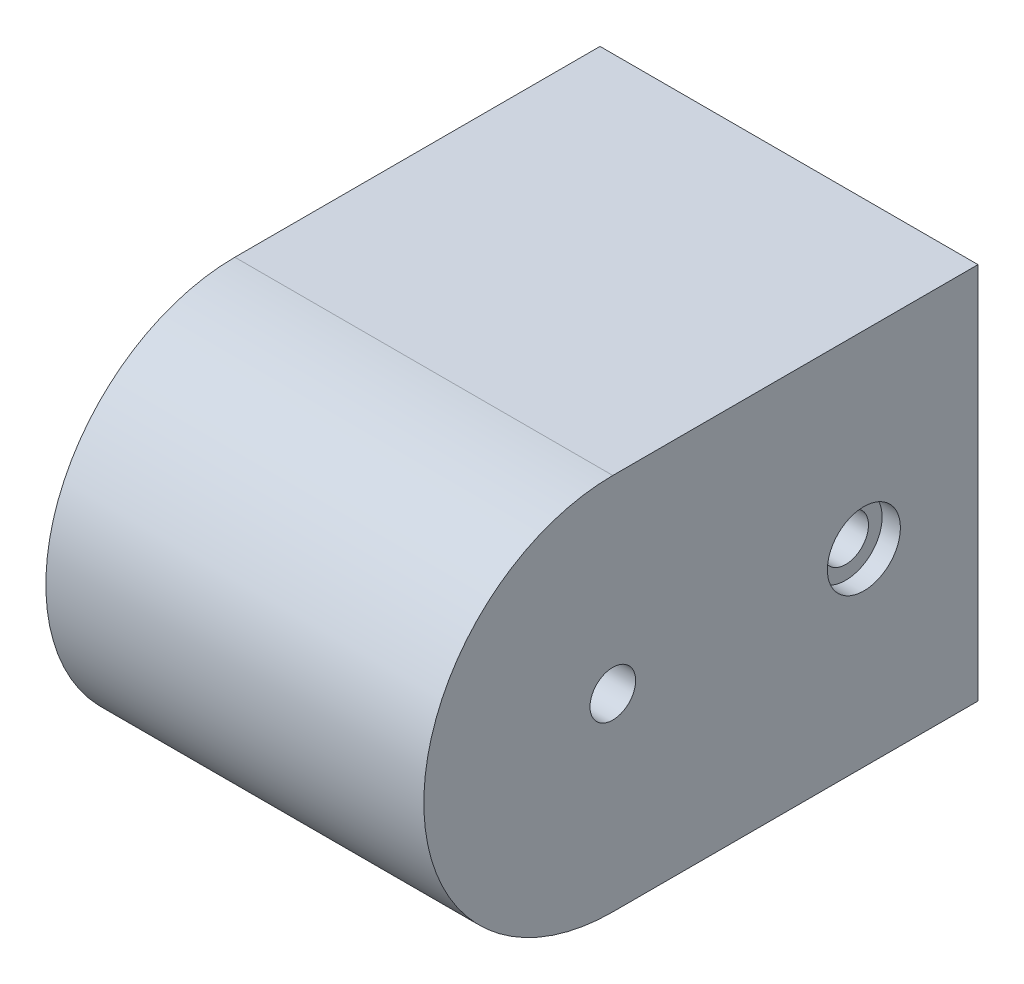
ISO-10303-21;
HEADER;
FILE_DESCRIPTION(('STEP AP214'),'2;1');
FILE_NAME('part.step','',(''),(''),'','','');
FILE_SCHEMA(('AUTOMOTIVE_DESIGN { 1 0 10303 214 1 1 1 1 }'));
ENDSEC;
DATA;
#1=APPLICATION_CONTEXT('core data for automotive mechanical design processes');
#2=APPLICATION_PROTOCOL_DEFINITION('international standard','automotive_design',2000,#1);
#3=PRODUCT_CONTEXT('',#1,'mechanical');
#4=PRODUCT('Part','Part','',(#3));
#5=PRODUCT_RELATED_PRODUCT_CATEGORY('part','',(#4));
#6=PRODUCT_DEFINITION_FORMATION('','',#4);
#7=PRODUCT_DEFINITION_CONTEXT('part definition',#1,'design');
#8=PRODUCT_DEFINITION('design','',#6,#7);
#9=PRODUCT_DEFINITION_SHAPE('','',#8);
#10=(LENGTH_UNIT() NAMED_UNIT(*) SI_UNIT(.MILLI.,.METRE.));
#11=(NAMED_UNIT(*) PLANE_ANGLE_UNIT() SI_UNIT($,.RADIAN.));
#12=(NAMED_UNIT(*) SI_UNIT($,.STERADIAN.) SOLID_ANGLE_UNIT());
#13=UNCERTAINTY_MEASURE_WITH_UNIT(LENGTH_MEASURE(1.E-05),#10,'distance_accuracy_value','');
#14=(GEOMETRIC_REPRESENTATION_CONTEXT(3) GLOBAL_UNCERTAINTY_ASSIGNED_CONTEXT((#13)) GLOBAL_UNIT_ASSIGNED_CONTEXT((#10,
#11,#12)) REPRESENTATION_CONTEXT('',''));
#15=CARTESIAN_POINT('',(0.,0.,0.));
#16=DIRECTION('',(0.,0.,1.));
#17=DIRECTION('',(1.,0.,0.));
#18=AXIS2_PLACEMENT_3D('',#15,#16,#17);
#19=CARTESIAN_POINT('',(27.7710678118655,0.,12.5));
#20=DIRECTION('',(-1.,0.,0.));
#21=DIRECTION('',(0.,0.,1.));
#22=AXIS2_PLACEMENT_3D('',#19,#20,#21);
#23=CYLINDRICAL_SURFACE('',#22,2.5);
#24=CARTESIAN_POINT('',(12.7,0.,12.5));
#25=DIRECTION('',(-1.,0.,0.));
#26=DIRECTION('',(0.,-1.,0.));
#27=AXIS2_PLACEMENT_3D('',#24,#25,#26);
#28=CIRCLE('',#27,2.5);
#29=CARTESIAN_POINT('',(12.7,-2.5,12.5));
#30=VERTEX_POINT('',#29);
#31=EDGE_CURVE('E173',#30,#30,#28,.T.);
#32=ORIENTED_EDGE('',*,*,#31,.T.);
#33=EDGE_LOOP('',(#32));
#34=FACE_BOUND('',#33,.T.);
#35=CARTESIAN_POINT('',(18.7,0.,12.5));
#36=DIRECTION('',(1.,0.,0.));
#37=DIRECTION('',(0.,0.,-1.));
#38=AXIS2_PLACEMENT_3D('',#35,#36,#37);
#39=CIRCLE('',#38,2.5);
#40=CARTESIAN_POINT('',(18.7,0.,10.));
#41=VERTEX_POINT('',#40);
#42=EDGE_CURVE('E36',#41,#41,#39,.F.);
#43=ORIENTED_EDGE('',*,*,#42,.F.);
#44=EDGE_LOOP('',(#43));
#45=FACE_BOUND('',#44,.T.);
#46=ADVANCED_FACE('F32',(#34,#45),#23,.F.);
#47=CARTESIAN_POINT('',(-12.7,0.,12.5));
#48=DIRECTION('',(1.,0.,0.));
#49=DIRECTION('',(0.,1.,0.));
#50=AXIS2_PLACEMENT_3D('',#47,#48,#49);
#51=CIRCLE('',#50,2.5);
#52=CARTESIAN_POINT('',(-12.7,2.5,12.5));
#53=VERTEX_POINT('',#52);
#54=EDGE_CURVE('E171',#53,#53,#51,.T.);
#55=ORIENTED_EDGE('',*,*,#54,.T.);
#56=EDGE_LOOP('',(#55));
#57=FACE_BOUND('',#56,.T.);
#58=CARTESIAN_POINT('',(-18.7,0.,12.5));
#59=DIRECTION('',(-1.,0.,0.));
#60=DIRECTION('',(0.,0.,1.));
#61=AXIS2_PLACEMENT_3D('',#58,#59,#60);
#62=CIRCLE('',#61,2.5);
#63=CARTESIAN_POINT('',(-18.7,0.,15.));
#64=VERTEX_POINT('',#63);
#65=EDGE_CURVE('E174',#64,#64,#62,.F.);
#66=ORIENTED_EDGE('',*,*,#65,.F.);
#67=EDGE_LOOP('',(#66));
#68=FACE_BOUND('',#67,.T.);
#69=ADVANCED_FACE('F213',(#57,#68),#23,.F.);
#70=CARTESIAN_POINT('',(0.,0.,0.));
#71=DIRECTION('',(0.,0.,1.));
#72=DIRECTION('',(1.,0.,0.));
#73=AXIS2_PLACEMENT_3D('',#70,#71,#72);
#74=PLANE('',#73);
#75=DIRECTION('',(0.,1.,0.));
#76=VECTOR('',#75,1.);
#77=CARTESIAN_POINT('',(20.7,20.7,0.));
#78=LINE('',#77,#76);
#79=CARTESIAN_POINT('',(20.7,-20.7,0.));
#80=VERTEX_POINT('',#79);
#81=CARTESIAN_POINT('',(20.7,20.7,0.));
#82=VERTEX_POINT('',#81);
#83=EDGE_CURVE('E161',#80,#82,#78,.T.);
#84=ORIENTED_EDGE('',*,*,#83,.F.);
#85=DIRECTION('',(1.,0.,0.));
#86=VECTOR('',#85,1.);
#87=CARTESIAN_POINT('',(-20.7,-20.7,0.));
#88=LINE('',#87,#86);
#89=CARTESIAN_POINT('',(-20.7,-20.7,0.));
#90=VERTEX_POINT('',#89);
#91=EDGE_CURVE('E167',#90,#80,#88,.T.);
#92=ORIENTED_EDGE('',*,*,#91,.F.);
#93=DIRECTION('',(0.,-1.,0.));
#94=VECTOR('',#93,1.);
#95=CARTESIAN_POINT('',(-20.7,20.7,0.));
#96=LINE('',#95,#94);
#97=CARTESIAN_POINT('',(-20.7,20.7,0.));
#98=VERTEX_POINT('',#97);
#99=EDGE_CURVE('E121',#98,#90,#96,.T.);
#100=ORIENTED_EDGE('',*,*,#99,.F.);
#101=DIRECTION('',(-1.,0.,0.));
#102=VECTOR('',#101,1.);
#103=CARTESIAN_POINT('',(-20.7,20.7,0.));
#104=LINE('',#103,#102);
#105=EDGE_CURVE('E164',#82,#98,#104,.T.);
#106=ORIENTED_EDGE('',*,*,#105,.F.);
#107=EDGE_LOOP('',(#84,#92,#100,#106));
#108=FACE_BOUND('',#107,.T.);
#109=DIRECTION('',(0.,1.,0.));
#110=VECTOR('',#109,1.);
#111=CARTESIAN_POINT('',(12.7,12.7,0.));
#112=LINE('',#111,#110);
#113=CARTESIAN_POINT('',(12.7,-12.7,0.));
#114=VERTEX_POINT('',#113);
#115=CARTESIAN_POINT('',(12.7,12.7,0.));
#116=VERTEX_POINT('',#115);
#117=EDGE_CURVE('E57',#114,#116,#112,.T.);
#118=ORIENTED_EDGE('',*,*,#117,.T.);
#119=DIRECTION('',(-1.,0.,0.));
#120=VECTOR('',#119,1.);
#121=CARTESIAN_POINT('',(-12.7,12.7,0.));
#122=LINE('',#121,#120);
#123=CARTESIAN_POINT('',(-12.7,12.7,0.));
#124=VERTEX_POINT('',#123);
#125=EDGE_CURVE('E146',#116,#124,#122,.T.);
#126=ORIENTED_EDGE('',*,*,#125,.T.);
#127=DIRECTION('',(0.,-1.,0.));
#128=VECTOR('',#127,1.);
#129=CARTESIAN_POINT('',(-12.7,12.7,0.));
#130=LINE('',#129,#128);
#131=CARTESIAN_POINT('',(-12.7,-12.7,0.));
#132=VERTEX_POINT('',#131);
#133=EDGE_CURVE('E149',#124,#132,#130,.T.);
#134=ORIENTED_EDGE('',*,*,#133,.T.);
#135=DIRECTION('',(1.,0.,0.));
#136=VECTOR('',#135,1.);
#137=CARTESIAN_POINT('',(-12.7,-12.7,0.));
#138=LINE('',#137,#136);
#139=EDGE_CURVE('E137',#132,#114,#138,.T.);
#140=ORIENTED_EDGE('',*,*,#139,.T.);
#141=EDGE_LOOP('',(#118,#126,#134,#140));
#142=FACE_BOUND('',#141,.T.);
#143=ADVANCED_FACE('F219',(#108,#142),#74,.F.);
#144=CARTESIAN_POINT('',(20.7,20.7,30.));
#145=DIRECTION('',(-1.,0.,0.));
#146=DIRECTION('',(0.,0.,1.));
#147=AXIS2_PLACEMENT_3D('',#144,#145,#146);
#148=PLANE('',#147);
#149=CARTESIAN_POINT('',(20.7,0.,12.5));
#150=DIRECTION('',(1.,0.,0.));
#151=DIRECTION('',(0.,0.,-1.));
#152=AXIS2_PLACEMENT_3D('',#149,#150,#151);
#153=CIRCLE('',#152,4.);
#154=CARTESIAN_POINT('',(20.7,0.,8.5));
#155=VERTEX_POINT('',#154);
#156=EDGE_CURVE('E187',#155,#155,#153,.T.);
#157=ORIENTED_EDGE('',*,*,#156,.F.);
#158=EDGE_LOOP('',(#157));
#159=FACE_BOUND('',#158,.T.);
#160=CARTESIAN_POINT('',(20.7,0.,40.));
#161=DIRECTION('',(1.,0.,0.));
#162=DIRECTION('',(0.,0.,-1.));
#163=AXIS2_PLACEMENT_3D('',#160,#161,#162);
#164=CIRCLE('',#163,2.5);
#165=CARTESIAN_POINT('',(20.7,0.,37.5));
#166=VERTEX_POINT('',#165);
#167=EDGE_CURVE('E191',#166,#166,#164,.T.);
#168=ORIENTED_EDGE('',*,*,#167,.F.);
#169=EDGE_LOOP('',(#168));
#170=FACE_BOUND('',#169,.T.);
#171=ORIENTED_EDGE('',*,*,#83,.T.);
#172=DIRECTION('',(0.,0.,-1.));
#173=VECTOR('',#172,1.);
#174=CARTESIAN_POINT('',(20.7,20.7,30.));
#175=LINE('',#174,#173);
#176=CARTESIAN_POINT('',(20.7,20.7,40.));
#177=VERTEX_POINT('',#176);
#178=EDGE_CURVE('E11',#177,#82,#175,.T.);
#179=ORIENTED_EDGE('',*,*,#178,.F.);
#180=CARTESIAN_POINT('',(20.7,0.,40.));
#181=DIRECTION('',(1.,0.,0.));
#182=DIRECTION('',(0.,0.,1.));
#183=AXIS2_PLACEMENT_3D('',#180,#181,#182);
#184=CIRCLE('',#183,20.7);
#185=CARTESIAN_POINT('',(20.7,-20.7,40.));
#186=VERTEX_POINT('',#185);
#187=EDGE_CURVE('E125',#177,#186,#184,.T.);
#188=ORIENTED_EDGE('',*,*,#187,.T.);
#189=DIRECTION('',(0.,0.,-1.));
#190=VECTOR('',#189,1.);
#191=CARTESIAN_POINT('',(20.7,-20.7,30.));
#192=LINE('',#191,#190);
#193=EDGE_CURVE('E107',#186,#80,#192,.T.);
#194=ORIENTED_EDGE('',*,*,#193,.T.);
#195=EDGE_LOOP('',(#171,#179,#188,#194));
#196=FACE_BOUND('',#195,.T.);
#197=ADVANCED_FACE('F34',(#159,#170,#196),#148,.F.);
#198=CARTESIAN_POINT('',(-20.7,20.7,30.));
#199=DIRECTION('',(0.,-1.,0.));
#200=DIRECTION('',(0.,0.,-1.));
#201=AXIS2_PLACEMENT_3D('',#198,#199,#200);
#202=PLANE('',#201);
#203=ORIENTED_EDGE('',*,*,#105,.T.);
#204=DIRECTION('',(0.,0.,-1.));
#205=VECTOR('',#204,1.);
#206=CARTESIAN_POINT('',(-20.7,20.7,30.));
#207=LINE('',#206,#205);
#208=CARTESIAN_POINT('',(-20.7,20.7,40.));
#209=VERTEX_POINT('',#208);
#210=EDGE_CURVE('E41',#209,#98,#207,.T.);
#211=ORIENTED_EDGE('',*,*,#210,.F.);
#212=DIRECTION('',(-1.,0.,0.));
#213=VECTOR('',#212,1.);
#214=CARTESIAN_POINT('',(-20.7,20.7,40.));
#215=LINE('',#214,#213);
#216=EDGE_CURVE('E112',#177,#209,#215,.T.);
#217=ORIENTED_EDGE('',*,*,#216,.F.);
#218=ORIENTED_EDGE('',*,*,#178,.T.);
#219=EDGE_LOOP('',(#203,#211,#217,#218));
#220=FACE_BOUND('',#219,.T.);
#221=ADVANCED_FACE('F201',(#220),#202,.F.);
#222=CARTESIAN_POINT('',(-20.7,20.7,30.));
#223=DIRECTION('',(1.,0.,0.));
#224=DIRECTION('',(0.,0.,-1.));
#225=AXIS2_PLACEMENT_3D('',#222,#223,#224);
#226=PLANE('',#225);
#227=CARTESIAN_POINT('',(-20.7,0.,12.5));
#228=DIRECTION('',(-1.,0.,0.));
#229=DIRECTION('',(0.,0.,1.));
#230=AXIS2_PLACEMENT_3D('',#227,#228,#229);
#231=CIRCLE('',#230,4.);
#232=CARTESIAN_POINT('',(-20.7,0.,16.5));
#233=VERTEX_POINT('',#232);
#234=EDGE_CURVE('E180',#233,#233,#231,.T.);
#235=ORIENTED_EDGE('',*,*,#234,.F.);
#236=EDGE_LOOP('',(#235));
#237=FACE_BOUND('',#236,.T.);
#238=CARTESIAN_POINT('',(-20.7,0.,40.));
#239=DIRECTION('',(1.,0.,0.));
#240=DIRECTION('',(0.,0.,-1.));
#241=AXIS2_PLACEMENT_3D('',#238,#239,#240);
#242=CIRCLE('',#241,2.5);
#243=CARTESIAN_POINT('',(-20.7,0.,37.5));
#244=VERTEX_POINT('',#243);
#245=EDGE_CURVE('E128',#244,#244,#242,.F.);
#246=ORIENTED_EDGE('',*,*,#245,.F.);
#247=EDGE_LOOP('',(#246));
#248=FACE_BOUND('',#247,.T.);
#249=ORIENTED_EDGE('',*,*,#99,.T.);
#250=DIRECTION('',(0.,0.,-1.));
#251=VECTOR('',#250,1.);
#252=CARTESIAN_POINT('',(-20.7,-20.7,30.));
#253=LINE('',#252,#251);
#254=CARTESIAN_POINT('',(-20.7,-20.7,40.));
#255=VERTEX_POINT('',#254);
#256=EDGE_CURVE('E104',#255,#90,#253,.T.);
#257=ORIENTED_EDGE('',*,*,#256,.F.);
#258=CARTESIAN_POINT('',(-20.7,0.,40.));
#259=DIRECTION('',(1.,0.,0.));
#260=DIRECTION('',(0.,0.,-1.));
#261=AXIS2_PLACEMENT_3D('',#258,#259,#260);
#262=CIRCLE('',#261,20.7);
#263=EDGE_CURVE('E118',#255,#209,#262,.F.);
#264=ORIENTED_EDGE('',*,*,#263,.T.);
#265=ORIENTED_EDGE('',*,*,#210,.T.);
#266=EDGE_LOOP('',(#249,#257,#264,#265));
#267=FACE_BOUND('',#266,.T.);
#268=ADVANCED_FACE('F116',(#237,#248,#267),#226,.F.);
#269=CARTESIAN_POINT('',(-20.7,-20.7,30.));
#270=DIRECTION('',(0.,1.,0.));
#271=DIRECTION('',(0.,0.,1.));
#272=AXIS2_PLACEMENT_3D('',#269,#270,#271);
#273=PLANE('',#272);
#274=ORIENTED_EDGE('',*,*,#91,.T.);
#275=ORIENTED_EDGE('',*,*,#193,.F.);
#276=DIRECTION('',(1.,0.,0.));
#277=VECTOR('',#276,1.);
#278=CARTESIAN_POINT('',(-20.7,-20.7,40.));
#279=LINE('',#278,#277);
#280=EDGE_CURVE('E101',#255,#186,#279,.T.);
#281=ORIENTED_EDGE('',*,*,#280,.F.);
#282=ORIENTED_EDGE('',*,*,#256,.T.);
#283=EDGE_LOOP('',(#274,#275,#281,#282));
#284=FACE_BOUND('',#283,.T.);
#285=ADVANCED_FACE('F103',(#284),#273,.F.);
#286=CARTESIAN_POINT('',(12.7,12.7,30.));
#287=DIRECTION('',(-1.,0.,0.));
#288=DIRECTION('',(0.,-1.,0.));
#289=AXIS2_PLACEMENT_3D('',#286,#287,#288);
#290=PLANE('',#289);
#291=ORIENTED_EDGE('',*,*,#31,.F.);
#292=EDGE_LOOP('',(#291));
#293=FACE_BOUND('',#292,.T.);
#294=ORIENTED_EDGE('',*,*,#117,.F.);
#295=DIRECTION('',(0.,0.,-1.));
#296=VECTOR('',#295,1.);
#297=CARTESIAN_POINT('',(12.7,-12.7,30.));
#298=LINE('',#297,#296);
#299=CARTESIAN_POINT('',(12.7,-12.7,30.));
#300=VERTEX_POINT('',#299);
#301=EDGE_CURVE('E144',#300,#114,#298,.T.);
#302=ORIENTED_EDGE('',*,*,#301,.F.);
#303=DIRECTION('',(0.,1.,0.));
#304=VECTOR('',#303,1.);
#305=CARTESIAN_POINT('',(12.7,12.7,30.));
#306=LINE('',#305,#304);
#307=CARTESIAN_POINT('',(12.7,12.7,30.));
#308=VERTEX_POINT('',#307);
#309=EDGE_CURVE('E133',#300,#308,#306,.T.);
#310=ORIENTED_EDGE('',*,*,#309,.T.);
#311=DIRECTION('',(0.,0.,-1.));
#312=VECTOR('',#311,1.);
#313=CARTESIAN_POINT('',(12.7,12.7,30.));
#314=LINE('',#313,#312);
#315=EDGE_CURVE('E159',#308,#116,#314,.T.);
#316=ORIENTED_EDGE('',*,*,#315,.T.);
#317=EDGE_LOOP('',(#294,#302,#310,#316));
#318=FACE_BOUND('',#317,.T.);
#319=ADVANCED_FACE('F208',(#293,#318),#290,.T.);
#320=CARTESIAN_POINT('',(-12.7,12.7,30.));
#321=DIRECTION('',(0.,-1.,0.));
#322=DIRECTION('',(0.,0.,-1.));
#323=AXIS2_PLACEMENT_3D('',#320,#321,#322);
#324=PLANE('',#323);
#325=ORIENTED_EDGE('',*,*,#125,.F.);
#326=ORIENTED_EDGE('',*,*,#315,.F.);
#327=DIRECTION('',(-1.,0.,0.));
#328=VECTOR('',#327,1.);
#329=CARTESIAN_POINT('',(-12.7,12.7,30.));
#330=LINE('',#329,#328);
#331=CARTESIAN_POINT('',(-12.7,12.7,30.));
#332=VERTEX_POINT('',#331);
#333=EDGE_CURVE('E136',#308,#332,#330,.T.);
#334=ORIENTED_EDGE('',*,*,#333,.T.);
#335=DIRECTION('',(0.,0.,-1.));
#336=VECTOR('',#335,1.);
#337=CARTESIAN_POINT('',(-12.7,12.7,30.));
#338=LINE('',#337,#336);
#339=EDGE_CURVE('E157',#332,#124,#338,.T.);
#340=ORIENTED_EDGE('',*,*,#339,.T.);
#341=EDGE_LOOP('',(#325,#326,#334,#340));
#342=FACE_BOUND('',#341,.T.);
#343=ADVANCED_FACE('F241',(#342),#324,.T.);
#344=CARTESIAN_POINT('',(-12.7,12.7,30.));
#345=DIRECTION('',(1.,0.,0.));
#346=DIRECTION('',(0.,1.,0.));
#347=AXIS2_PLACEMENT_3D('',#344,#345,#346);
#348=PLANE('',#347);
#349=ORIENTED_EDGE('',*,*,#54,.F.);
#350=EDGE_LOOP('',(#349));
#351=FACE_BOUND('',#350,.T.);
#352=ORIENTED_EDGE('',*,*,#133,.F.);
#353=ORIENTED_EDGE('',*,*,#339,.F.);
#354=DIRECTION('',(0.,-1.,0.));
#355=VECTOR('',#354,1.);
#356=CARTESIAN_POINT('',(-12.7,12.7,30.));
#357=LINE('',#356,#355);
#358=CARTESIAN_POINT('',(-12.7,-12.7,30.));
#359=VERTEX_POINT('',#358);
#360=EDGE_CURVE('E140',#332,#359,#357,.T.);
#361=ORIENTED_EDGE('',*,*,#360,.T.);
#362=DIRECTION('',(0.,0.,-1.));
#363=VECTOR('',#362,1.);
#364=CARTESIAN_POINT('',(-12.7,-12.7,30.));
#365=LINE('',#364,#363);
#366=EDGE_CURVE('E155',#359,#132,#365,.T.);
#367=ORIENTED_EDGE('',*,*,#366,.T.);
#368=EDGE_LOOP('',(#352,#353,#361,#367));
#369=FACE_BOUND('',#368,.T.);
#370=ADVANCED_FACE('F237',(#351,#369),#348,.T.);
#371=CARTESIAN_POINT('',(-12.7,-12.7,30.));
#372=DIRECTION('',(0.,1.,0.));
#373=DIRECTION('',(0.,0.,1.));
#374=AXIS2_PLACEMENT_3D('',#371,#372,#373);
#375=PLANE('',#374);
#376=ORIENTED_EDGE('',*,*,#139,.F.);
#377=ORIENTED_EDGE('',*,*,#366,.F.);
#378=DIRECTION('',(1.,0.,0.));
#379=VECTOR('',#378,1.);
#380=CARTESIAN_POINT('',(-12.7,-12.7,30.));
#381=LINE('',#380,#379);
#382=EDGE_CURVE('E49',#359,#300,#381,.T.);
#383=ORIENTED_EDGE('',*,*,#382,.T.);
#384=ORIENTED_EDGE('',*,*,#301,.T.);
#385=EDGE_LOOP('',(#376,#377,#383,#384));
#386=FACE_BOUND('',#385,.T.);
#387=ADVANCED_FACE('F234',(#386),#375,.T.);
#388=CARTESIAN_POINT('',(0.,0.,30.));
#389=DIRECTION('',(0.,0.,1.));
#390=DIRECTION('',(1.,0.,0.));
#391=AXIS2_PLACEMENT_3D('',#388,#389,#390);
#392=PLANE('',#391);
#393=ORIENTED_EDGE('',*,*,#333,.F.);
#394=ORIENTED_EDGE('',*,*,#309,.F.);
#395=ORIENTED_EDGE('',*,*,#382,.F.);
#396=ORIENTED_EDGE('',*,*,#360,.F.);
#397=EDGE_LOOP('',(#393,#394,#395,#396));
#398=FACE_BOUND('',#397,.T.);
#399=ADVANCED_FACE('F231',(#398),#392,.F.);
#400=CARTESIAN_POINT('',(-66.9866071342456,0.,40.));
#401=DIRECTION('',(1.,0.,0.));
#402=DIRECTION('',(0.,0.,-1.));
#403=AXIS2_PLACEMENT_3D('',#400,#401,#402);
#404=CYLINDRICAL_SURFACE('',#403,20.7);
#405=ORIENTED_EDGE('',*,*,#263,.F.);
#406=ORIENTED_EDGE('',*,*,#280,.T.);
#407=ORIENTED_EDGE('',*,*,#187,.F.);
#408=ORIENTED_EDGE('',*,*,#216,.T.);
#409=EDGE_LOOP('',(#405,#406,#407,#408));
#410=FACE_BOUND('',#409,.T.);
#411=ADVANCED_FACE('F123',(#410),#404,.T.);
#412=CARTESIAN_POINT('',(-27.7710678118655,0.,40.));
#413=DIRECTION('',(1.,0.,0.));
#414=DIRECTION('',(0.,0.,-1.));
#415=AXIS2_PLACEMENT_3D('',#412,#413,#414);
#416=CYLINDRICAL_SURFACE('',#415,2.5);
#417=ORIENTED_EDGE('',*,*,#245,.T.);
#418=EDGE_LOOP('',(#417));
#419=FACE_BOUND('',#418,.T.);
#420=ORIENTED_EDGE('',*,*,#167,.T.);
#421=EDGE_LOOP('',(#420));
#422=FACE_BOUND('',#421,.T.);
#423=ADVANCED_FACE('F198',(#419,#422),#416,.F.);
#424=CARTESIAN_POINT('',(-18.7,0.,12.5));
#425=DIRECTION('',(-1.,0.,0.));
#426=DIRECTION('',(0.,0.,1.));
#427=AXIS2_PLACEMENT_3D('',#424,#425,#426);
#428=PLANE('',#427);
#429=CARTESIAN_POINT('',(-18.7,0.,12.5));
#430=DIRECTION('',(-1.,0.,0.));
#431=DIRECTION('',(0.,0.,1.));
#432=AXIS2_PLACEMENT_3D('',#429,#430,#431);
#433=CIRCLE('',#432,4.);
#434=CARTESIAN_POINT('',(-18.7,0.,16.5));
#435=VERTEX_POINT('',#434);
#436=EDGE_CURVE('E176',#435,#435,#433,.T.);
#437=ORIENTED_EDGE('',*,*,#436,.T.);
#438=EDGE_LOOP('',(#437));
#439=FACE_BOUND('',#438,.T.);
#440=ORIENTED_EDGE('',*,*,#65,.T.);
#441=EDGE_LOOP('',(#440));
#442=FACE_BOUND('',#441,.T.);
#443=ADVANCED_FACE('F228',(#439,#442),#428,.T.);
#444=CARTESIAN_POINT('',(-18.7,0.,12.5));
#445=DIRECTION('',(-1.,0.,0.));
#446=DIRECTION('',(0.,0.,1.));
#447=AXIS2_PLACEMENT_3D('',#444,#445,#446);
#448=CYLINDRICAL_SURFACE('',#447,4.);
#449=ORIENTED_EDGE('',*,*,#436,.F.);
#450=EDGE_LOOP('',(#449));
#451=FACE_BOUND('',#450,.T.);
#452=ORIENTED_EDGE('',*,*,#234,.T.);
#453=EDGE_LOOP('',(#452));
#454=FACE_BOUND('',#453,.T.);
#455=ADVANCED_FACE('F224',(#451,#454),#448,.F.);
#456=CARTESIAN_POINT('',(18.7,0.,12.5));
#457=DIRECTION('',(1.,0.,0.));
#458=DIRECTION('',(0.,0.,-1.));
#459=AXIS2_PLACEMENT_3D('',#456,#457,#458);
#460=PLANE('',#459);
#461=CARTESIAN_POINT('',(18.7,0.,12.5));
#462=DIRECTION('',(1.,0.,0.));
#463=DIRECTION('',(0.,0.,-1.));
#464=AXIS2_PLACEMENT_3D('',#461,#462,#463);
#465=CIRCLE('',#464,4.);
#466=CARTESIAN_POINT('',(18.7,0.,8.5));
#467=VERTEX_POINT('',#466);
#468=EDGE_CURVE('E269',#467,#467,#465,.T.);
#469=ORIENTED_EDGE('',*,*,#468,.T.);
#470=EDGE_LOOP('',(#469));
#471=FACE_BOUND('',#470,.T.);
#472=ORIENTED_EDGE('',*,*,#42,.T.);
#473=EDGE_LOOP('',(#472));
#474=FACE_BOUND('',#473,.T.);
#475=ADVANCED_FACE('F276',(#471,#474),#460,.T.);
#476=CARTESIAN_POINT('',(18.7,0.,12.5));
#477=DIRECTION('',(1.,0.,0.));
#478=DIRECTION('',(0.,0.,-1.));
#479=AXIS2_PLACEMENT_3D('',#476,#477,#478);
#480=CYLINDRICAL_SURFACE('',#479,4.);
#481=ORIENTED_EDGE('',*,*,#468,.F.);
#482=EDGE_LOOP('',(#481));
#483=FACE_BOUND('',#482,.T.);
#484=ORIENTED_EDGE('',*,*,#156,.T.);
#485=EDGE_LOOP('',(#484));
#486=FACE_BOUND('',#485,.T.);
#487=ADVANCED_FACE('F278',(#483,#486),#480,.F.);
#488=CLOSED_SHELL('',(#46,#69,#143,#197,#221,#268,#285,#319,#343,#370,#387,#399,#411,#423,#443,
#455,#475,#487));
#489=MANIFOLD_SOLID_BREP('B2',#488);
#490=ADVANCED_BREP_SHAPE_REPRESENTATION('',(#18,#489),#14);
#491=SHAPE_DEFINITION_REPRESENTATION(#9,#490);
ENDSEC;
END-ISO-10303-21;
